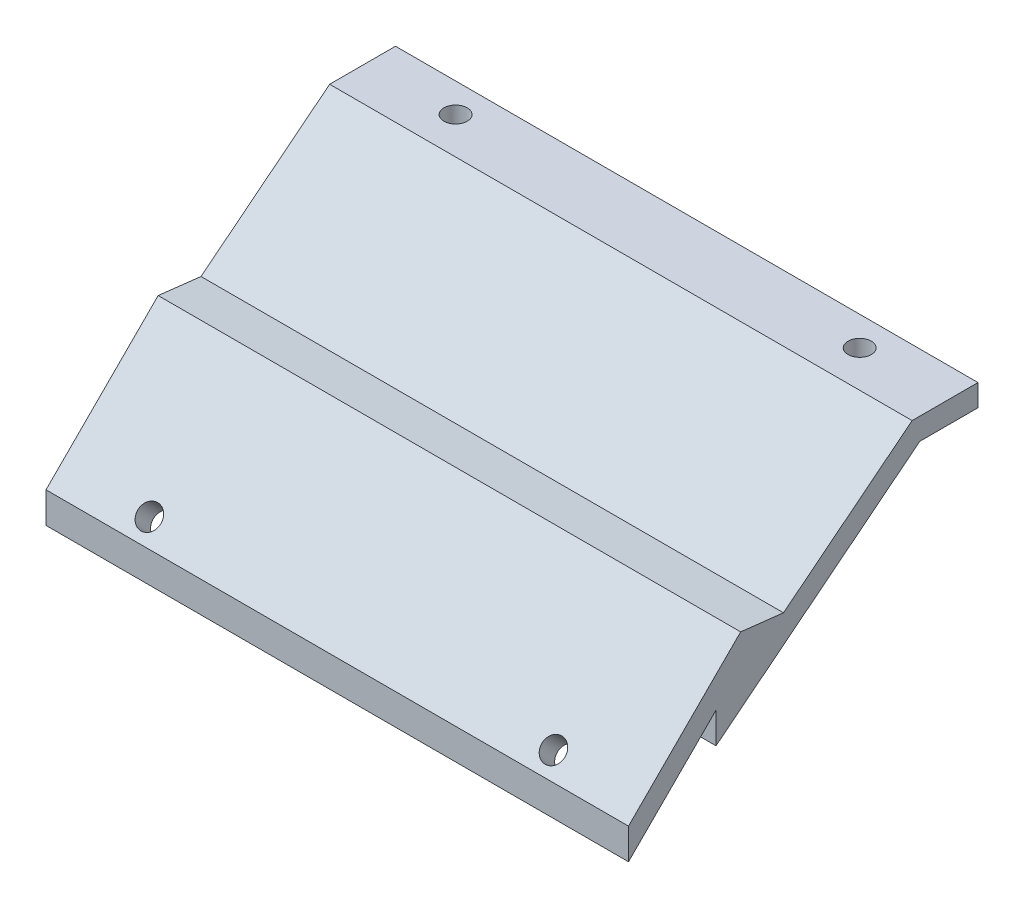
ISO-10303-21;
HEADER;
FILE_DESCRIPTION(('STEP AP214'),'2;1');
FILE_NAME('part.step','',(''),(''),'','','');
FILE_SCHEMA(('AUTOMOTIVE_DESIGN { 1 0 10303 214 1 1 1 1 }'));
ENDSEC;
DATA;
#1=APPLICATION_CONTEXT('core data for automotive mechanical design processes');
#2=APPLICATION_PROTOCOL_DEFINITION('international standard','automotive_design',2000,#1);
#3=PRODUCT_CONTEXT('',#1,'mechanical');
#4=PRODUCT('Part','Part','',(#3));
#5=PRODUCT_RELATED_PRODUCT_CATEGORY('part','',(#4));
#6=PRODUCT_DEFINITION_FORMATION('','',#4);
#7=PRODUCT_DEFINITION_CONTEXT('part definition',#1,'design');
#8=PRODUCT_DEFINITION('design','',#6,#7);
#9=PRODUCT_DEFINITION_SHAPE('','',#8);
#10=(LENGTH_UNIT() NAMED_UNIT(*) SI_UNIT(.MILLI.,.METRE.));
#11=(NAMED_UNIT(*) PLANE_ANGLE_UNIT() SI_UNIT($,.RADIAN.));
#12=(NAMED_UNIT(*) SI_UNIT($,.STERADIAN.) SOLID_ANGLE_UNIT());
#13=UNCERTAINTY_MEASURE_WITH_UNIT(LENGTH_MEASURE(1.E-05),#10,'distance_accuracy_value','');
#14=(GEOMETRIC_REPRESENTATION_CONTEXT(3) GLOBAL_UNCERTAINTY_ASSIGNED_CONTEXT((#13)) GLOBAL_UNIT_ASSIGNED_CONTEXT((#10,
#11,#12)) REPRESENTATION_CONTEXT('',''));
#15=CARTESIAN_POINT('',(0.,0.,0.));
#16=DIRECTION('',(0.,0.,1.));
#17=DIRECTION('',(1.,0.,0.));
#18=AXIS2_PLACEMENT_3D('',#15,#16,#17);
#19=CARTESIAN_POINT('',(40.,0.,0.));
#20=DIRECTION('',(0.,-0.707106781186551,-0.707106781186544));
#21=DIRECTION('',(0.,0.707106781186544,-0.707106781186551));
#22=AXIS2_PLACEMENT_3D('',#19,#20,#21);
#23=PLANE('',#22);
#24=CARTESIAN_POINT('',(27.75,1.94454364826302,-1.94454364826303));
#25=DIRECTION('',(0.,-0.707106781186551,-0.707106781186544));
#26=DIRECTION('',(0.,0.707106781186544,-0.707106781186551));
#27=AXIS2_PLACEMENT_3D('',#24,#25,#26);
#28=CIRCLE('',#27,1.6);
#29=CARTESIAN_POINT('',(27.75,3.07591449816149,-3.07591449816152));
#30=VERTEX_POINT('',#29);
#31=EDGE_CURVE('E164',#30,#30,#28,.F.);
#32=ORIENTED_EDGE('',*,*,#31,.F.);
#33=EDGE_LOOP('',(#32));
#34=FACE_BOUND('',#33,.T.);
#35=CARTESIAN_POINT('',(-27.75,1.94454364826302,-1.94454364826304));
#36=DIRECTION('',(0.,-0.707106781186551,-0.707106781186544));
#37=DIRECTION('',(0.,0.707106781186544,-0.707106781186551));
#38=AXIS2_PLACEMENT_3D('',#35,#36,#37);
#39=CIRCLE('',#38,1.6);
#40=CARTESIAN_POINT('',(-27.75,3.07591449816149,-3.07591449816153));
#41=VERTEX_POINT('',#40);
#42=EDGE_CURVE('E249',#41,#41,#39,.F.);
#43=ORIENTED_EDGE('',*,*,#42,.F.);
#44=EDGE_LOOP('',(#43));
#45=FACE_BOUND('',#44,.T.);
#46=DIRECTION('',(0.,-0.707106781186544,0.707106781186551));
#47=VECTOR('',#46,1.);
#48=CARTESIAN_POINT('',(-40.,0.,0.));
#49=LINE('',#48,#47);
#50=CARTESIAN_POINT('',(-40.,15.4017394456447,-15.4017394456449));
#51=VERTEX_POINT('',#50);
#52=CARTESIAN_POINT('',(-40.,0.,0.));
#53=VERTEX_POINT('',#52);
#54=EDGE_CURVE('E65',#51,#53,#49,.T.);
#55=ORIENTED_EDGE('',*,*,#54,.T.);
#56=DIRECTION('',(-1.,0.,0.));
#57=VECTOR('',#56,1.);
#58=CARTESIAN_POINT('',(40.,0.,0.));
#59=LINE('',#58,#57);
#60=CARTESIAN_POINT('',(40.,0.,0.));
#61=VERTEX_POINT('',#60);
#62=EDGE_CURVE('E190',#61,#53,#59,.T.);
#63=ORIENTED_EDGE('',*,*,#62,.F.);
#64=DIRECTION('',(0.,-0.707106781186544,0.707106781186551));
#65=VECTOR('',#64,1.);
#66=CARTESIAN_POINT('',(40.,0.,0.));
#67=LINE('',#66,#65);
#68=CARTESIAN_POINT('',(40.,15.4017394456447,-15.4017394456449));
#69=VERTEX_POINT('',#68);
#70=EDGE_CURVE('E58',#69,#61,#67,.T.);
#71=ORIENTED_EDGE('',*,*,#70,.F.);
#72=DIRECTION('',(1.,0.,0.));
#73=VECTOR('',#72,1.);
#74=CARTESIAN_POINT('',(40.,15.4017394456447,-15.4017394456449));
#75=LINE('',#74,#73);
#76=EDGE_CURVE('E196',#69,#51,#75,.F.);
#77=ORIENTED_EDGE('',*,*,#76,.T.);
#78=EDGE_LOOP('',(#55,#63,#71,#77));
#79=FACE_BOUND('',#78,.T.);
#80=ADVANCED_FACE('F41',(#34,#45,#79),#23,.F.);
#81=CARTESIAN_POINT('',(40.,0.,0.));
#82=DIRECTION('',(0.,0.,-1.));
#83=DIRECTION('',(0.,1.,0.));
#84=AXIS2_PLACEMENT_3D('',#81,#82,#83);
#85=PLANE('',#84);
#86=DIRECTION('',(0.,-1.,0.));
#87=VECTOR('',#86,1.);
#88=CARTESIAN_POINT('',(-40.,0.,0.));
#89=LINE('',#88,#87);
#90=CARTESIAN_POINT('',(-40.,-4.24264068711926,0.));
#91=VERTEX_POINT('',#90);
#92=EDGE_CURVE('E163',#53,#91,#89,.T.);
#93=ORIENTED_EDGE('',*,*,#92,.T.);
#94=DIRECTION('',(-1.,0.,0.));
#95=VECTOR('',#94,1.);
#96=CARTESIAN_POINT('',(40.,-4.24264068711926,0.));
#97=LINE('',#96,#95);
#98=CARTESIAN_POINT('',(40.,-4.24264068711926,0.));
#99=VERTEX_POINT('',#98);
#100=EDGE_CURVE('E186',#99,#91,#97,.T.);
#101=ORIENTED_EDGE('',*,*,#100,.F.);
#102=DIRECTION('',(0.,-1.,0.));
#103=VECTOR('',#102,1.);
#104=CARTESIAN_POINT('',(40.,0.,0.));
#105=LINE('',#104,#103);
#106=EDGE_CURVE('E203',#61,#99,#105,.T.);
#107=ORIENTED_EDGE('',*,*,#106,.F.);
#108=ORIENTED_EDGE('',*,*,#62,.T.);
#109=EDGE_LOOP('',(#93,#101,#107,#108));
#110=FACE_BOUND('',#109,.T.);
#111=ADVANCED_FACE('F208',(#110),#85,.F.);
#112=CARTESIAN_POINT('',(40.,7.77817459305199,-12.0208152801714));
#113=DIRECTION('',(0.,0.707106781186551,0.707106781186544));
#114=DIRECTION('',(0.,-0.707106781186544,0.707106781186551));
#115=AXIS2_PLACEMENT_3D('',#112,#113,#114);
#116=PLANE('',#115);
#117=CARTESIAN_POINT('',(27.75,-0.176776695296637,-4.06586399182266));
#118=DIRECTION('',(0.,-0.707106781186551,-0.707106781186544));
#119=DIRECTION('',(0.,0.707106781186544,-0.707106781186551));
#120=AXIS2_PLACEMENT_3D('',#117,#118,#119);
#121=CIRCLE('',#120,1.6);
#122=CARTESIAN_POINT('',(27.75,0.954594154601834,-5.19723484172115));
#123=VERTEX_POINT('',#122);
#124=EDGE_CURVE('E245',#123,#123,#121,.T.);
#125=ORIENTED_EDGE('',*,*,#124,.F.);
#126=EDGE_LOOP('',(#125));
#127=FACE_BOUND('',#126,.T.);
#128=CARTESIAN_POINT('',(-27.75,-0.17677669529663,-4.06586399182267));
#129=DIRECTION('',(0.,-0.707106781186551,-0.707106781186544));
#130=DIRECTION('',(0.,0.707106781186544,-0.707106781186551));
#131=AXIS2_PLACEMENT_3D('',#128,#129,#130);
#132=CIRCLE('',#131,1.6);
#133=CARTESIAN_POINT('',(-27.75,0.954594154601841,-5.19723484172115));
#134=VERTEX_POINT('',#133);
#135=EDGE_CURVE('E244',#134,#134,#132,.T.);
#136=ORIENTED_EDGE('',*,*,#135,.F.);
#137=EDGE_LOOP('',(#136));
#138=FACE_BOUND('',#137,.T.);
#139=DIRECTION('',(0.,0.707106781186544,-0.707106781186551));
#140=VECTOR('',#139,1.);
#141=CARTESIAN_POINT('',(-40.,7.77817459305199,-12.0208152801714));
#142=LINE('',#141,#140);
#143=CARTESIAN_POINT('',(-40.,7.77817459305199,-12.0208152801714));
#144=VERTEX_POINT('',#143);
#145=EDGE_CURVE('E167',#91,#144,#142,.T.);
#146=ORIENTED_EDGE('',*,*,#145,.T.);
#147=DIRECTION('',(-1.,0.,0.));
#148=VECTOR('',#147,1.);
#149=CARTESIAN_POINT('',(40.,7.77817459305199,-12.0208152801714));
#150=LINE('',#149,#148);
#151=CARTESIAN_POINT('',(40.,7.77817459305199,-12.0208152801714));
#152=VERTEX_POINT('',#151);
#153=EDGE_CURVE('E182',#152,#144,#150,.T.);
#154=ORIENTED_EDGE('',*,*,#153,.F.);
#155=DIRECTION('',(0.,0.707106781186544,-0.707106781186551));
#156=VECTOR('',#155,1.);
#157=CARTESIAN_POINT('',(40.,7.77817459305199,-12.0208152801714));
#158=LINE('',#157,#156);
#159=EDGE_CURVE('E211',#99,#152,#158,.T.);
#160=ORIENTED_EDGE('',*,*,#159,.F.);
#161=ORIENTED_EDGE('',*,*,#100,.T.);
#162=EDGE_LOOP('',(#146,#154,#160,#161));
#163=FACE_BOUND('',#162,.T.);
#164=ADVANCED_FACE('F267',(#127,#138,#163),#116,.F.);
#165=CARTESIAN_POINT('',(40.,3.53817459305199,-12.0208152801714));
#166=DIRECTION('',(0.,0.,-1.));
#167=DIRECTION('',(-1.,0.,0.));
#168=AXIS2_PLACEMENT_3D('',#165,#166,#167);
#169=PLANE('',#168);
#170=DIRECTION('',(0.,-1.,0.));
#171=VECTOR('',#170,1.);
#172=CARTESIAN_POINT('',(-40.,3.53817459305199,-12.0208152801714));
#173=LINE('',#172,#171);
#174=CARTESIAN_POINT('',(-40.,3.53817459305199,-12.0208152801714));
#175=VERTEX_POINT('',#174);
#176=EDGE_CURVE('E170',#144,#175,#173,.T.);
#177=ORIENTED_EDGE('',*,*,#176,.T.);
#178=DIRECTION('',(-1.,0.,0.));
#179=VECTOR('',#178,1.);
#180=CARTESIAN_POINT('',(40.,3.53817459305199,-12.0208152801714));
#181=LINE('',#180,#179);
#182=CARTESIAN_POINT('',(40.,3.53817459305199,-12.0208152801714));
#183=VERTEX_POINT('',#182);
#184=EDGE_CURVE('E155',#183,#175,#181,.T.);
#185=ORIENTED_EDGE('',*,*,#184,.F.);
#186=DIRECTION('',(0.,-1.,0.));
#187=VECTOR('',#186,1.);
#188=CARTESIAN_POINT('',(40.,3.53817459305199,-12.0208152801714));
#189=LINE('',#188,#187);
#190=EDGE_CURVE('E157',#152,#183,#189,.T.);
#191=ORIENTED_EDGE('',*,*,#190,.F.);
#192=ORIENTED_EDGE('',*,*,#153,.T.);
#193=EDGE_LOOP('',(#177,#185,#191,#192));
#194=FACE_BOUND('',#193,.T.);
#195=ADVANCED_FACE('F223',(#194),#169,.F.);
#196=CARTESIAN_POINT('',(40.,25.7573593128807,-40.));
#197=DIRECTION('',(0.,0.783105117367852,0.621889359253141));
#198=DIRECTION('',(0.,-0.621889359253141,0.783105117367852));
#199=AXIS2_PLACEMENT_3D('',#196,#197,#198);
#200=PLANE('',#199);
#201=DIRECTION('',(0.,0.621889359253141,-0.783105117367852));
#202=VECTOR('',#201,1.);
#203=CARTESIAN_POINT('',(-40.,25.7573593128807,-40.));
#204=LINE('',#203,#202);
#205=CARTESIAN_POINT('',(-40.,25.7573593128807,-40.));
#206=VERTEX_POINT('',#205);
#207=EDGE_CURVE('E173',#175,#206,#204,.T.);
#208=ORIENTED_EDGE('',*,*,#207,.T.);
#209=DIRECTION('',(-1.,0.,0.));
#210=VECTOR('',#209,1.);
#211=CARTESIAN_POINT('',(40.,25.7573593128807,-40.));
#212=LINE('',#211,#210);
#213=CARTESIAN_POINT('',(40.,25.7573593128807,-40.));
#214=VERTEX_POINT('',#213);
#215=EDGE_CURVE('E149',#214,#206,#212,.T.);
#216=ORIENTED_EDGE('',*,*,#215,.F.);
#217=DIRECTION('',(0.,0.621889359253141,-0.783105117367852));
#218=VECTOR('',#217,1.);
#219=CARTESIAN_POINT('',(40.,25.7573593128807,-40.));
#220=LINE('',#219,#218);
#221=EDGE_CURVE('E150',#183,#214,#220,.T.);
#222=ORIENTED_EDGE('',*,*,#221,.F.);
#223=ORIENTED_EDGE('',*,*,#184,.T.);
#224=EDGE_LOOP('',(#208,#216,#222,#223));
#225=FACE_BOUND('',#224,.T.);
#226=ADVANCED_FACE('F227',(#225),#200,.F.);
#227=CARTESIAN_POINT('',(40.,9.75147593644475,-15.0208152801714));
#228=DIRECTION('',(0.,-0.783105117367852,-0.621889359253141));
#229=DIRECTION('',(0.,0.621889359253141,-0.783105117367852));
#230=AXIS2_PLACEMENT_3D('',#227,#228,#229);
#231=PLANE('',#230);
#232=DIRECTION('',(0.,-0.621889359253141,0.783105117367852));
#233=VECTOR('',#232,1.);
#234=CARTESIAN_POINT('',(-40.,9.75147593644475,-15.0208152801714));
#235=LINE('',#234,#233);
#236=CARTESIAN_POINT('',(-40.,28.7573593128807,-38.9536970874081));
#237=VERTEX_POINT('',#236);
#238=CARTESIAN_POINT('',(-40.,14.7265908104699,-21.2856562191142));
#239=VERTEX_POINT('',#238);
#240=EDGE_CURVE('E176',#237,#239,#235,.T.);
#241=ORIENTED_EDGE('',*,*,#240,.T.);
#242=DIRECTION('',(1.,0.,0.));
#243=VECTOR('',#242,1.);
#244=CARTESIAN_POINT('',(40.,14.7265908104699,-21.2856562191142));
#245=LINE('',#244,#243);
#246=CARTESIAN_POINT('',(40.,14.7265908104699,-21.2856562191142));
#247=VERTEX_POINT('',#246);
#248=EDGE_CURVE('E147',#239,#247,#245,.T.);
#249=ORIENTED_EDGE('',*,*,#248,.T.);
#250=DIRECTION('',(0.,-0.621889359253141,0.783105117367852));
#251=VECTOR('',#250,1.);
#252=CARTESIAN_POINT('',(40.,9.75147593644475,-15.0208152801714));
#253=LINE('',#252,#251);
#254=CARTESIAN_POINT('',(40.,28.7573593128807,-38.9536970874081));
#255=VERTEX_POINT('',#254);
#256=EDGE_CURVE('E125',#255,#247,#253,.T.);
#257=ORIENTED_EDGE('',*,*,#256,.F.);
#258=DIRECTION('',(-1.,0.,0.));
#259=VECTOR('',#258,1.);
#260=CARTESIAN_POINT('',(40.,28.7573593128807,-38.9536970874081));
#261=LINE('',#260,#259);
#262=EDGE_CURVE('E134',#255,#237,#261,.T.);
#263=ORIENTED_EDGE('',*,*,#262,.T.);
#264=EDGE_LOOP('',(#241,#249,#257,#263));
#265=FACE_BOUND('',#264,.T.);
#266=ADVANCED_FACE('F145',(#265),#231,.F.);
#267=CARTESIAN_POINT('',(40.,0.,0.));
#268=DIRECTION('',(-1.,0.,0.));
#269=DIRECTION('',(0.,0.,1.));
#270=AXIS2_PLACEMENT_3D('',#267,#268,#269);
#271=PLANE('',#270);
#272=DIRECTION('',(0.,0.,1.));
#273=VECTOR('',#272,1.);
#274=CARTESIAN_POINT('',(40.,28.7573593128807,-48.));
#275=LINE('',#274,#273);
#276=CARTESIAN_POINT('',(40.,28.7573593128807,-48.));
#277=VERTEX_POINT('',#276);
#278=EDGE_CURVE('E121',#277,#255,#275,.T.);
#279=ORIENTED_EDGE('',*,*,#278,.T.);
#280=ORIENTED_EDGE('',*,*,#256,.T.);
#281=DIRECTION('',(0.,-0.11399675579705,-0.993481121948348));
#282=VECTOR('',#281,1.);
#283=CARTESIAN_POINT('',(40.,16.9458926531585,-1.94445243484514));
#284=LINE('',#283,#282);
#285=EDGE_CURVE('E11',#247,#69,#284,.F.);
#286=ORIENTED_EDGE('',*,*,#285,.T.);
#287=ORIENTED_EDGE('',*,*,#70,.T.);
#288=ORIENTED_EDGE('',*,*,#106,.T.);
#289=ORIENTED_EDGE('',*,*,#159,.T.);
#290=ORIENTED_EDGE('',*,*,#190,.T.);
#291=ORIENTED_EDGE('',*,*,#221,.T.);
#292=DIRECTION('',(0.,0.,1.));
#293=VECTOR('',#292,1.);
#294=CARTESIAN_POINT('',(40.,25.7573593128807,-48.));
#295=LINE('',#294,#293);
#296=CARTESIAN_POINT('',(40.,25.7573593128807,-48.));
#297=VERTEX_POINT('',#296);
#298=EDGE_CURVE('E131',#297,#214,#295,.T.);
#299=ORIENTED_EDGE('',*,*,#298,.F.);
#300=DIRECTION('',(0.,-1.,0.));
#301=VECTOR('',#300,1.);
#302=CARTESIAN_POINT('',(40.,28.7573593128807,-48.));
#303=LINE('',#302,#301);
#304=EDGE_CURVE('E127',#277,#297,#303,.T.);
#305=ORIENTED_EDGE('',*,*,#304,.F.);
#306=EDGE_LOOP('',(#279,#280,#286,#287,#288,#289,#290,#291,#299,#305));
#307=FACE_BOUND('',#306,.T.);
#308=ADVANCED_FACE('F123',(#307),#271,.F.);
#309=CARTESIAN_POINT('',(-40.,0.,0.));
#310=DIRECTION('',(-1.,0.,0.));
#311=DIRECTION('',(0.,0.,1.));
#312=AXIS2_PLACEMENT_3D('',#309,#310,#311);
#313=PLANE('',#312);
#314=ORIENTED_EDGE('',*,*,#240,.F.);
#315=DIRECTION('',(0.,0.,1.));
#316=VECTOR('',#315,1.);
#317=CARTESIAN_POINT('',(-40.,28.7573593128807,-48.));
#318=LINE('',#317,#316);
#319=CARTESIAN_POINT('',(-40.,28.7573593128807,-48.));
#320=VERTEX_POINT('',#319);
#321=EDGE_CURVE('E130',#320,#237,#318,.T.);
#322=ORIENTED_EDGE('',*,*,#321,.F.);
#323=DIRECTION('',(0.,1.,0.));
#324=VECTOR('',#323,1.);
#325=CARTESIAN_POINT('',(-40.,28.7573593128807,-48.));
#326=LINE('',#325,#324);
#327=CARTESIAN_POINT('',(-40.,25.7573593128807,-48.));
#328=VERTEX_POINT('',#327);
#329=EDGE_CURVE('E141',#328,#320,#326,.T.);
#330=ORIENTED_EDGE('',*,*,#329,.F.);
#331=DIRECTION('',(0.,0.,1.));
#332=VECTOR('',#331,1.);
#333=CARTESIAN_POINT('',(-40.,25.7573593128807,-48.));
#334=LINE('',#333,#332);
#335=EDGE_CURVE('E236',#328,#206,#334,.T.);
#336=ORIENTED_EDGE('',*,*,#335,.T.);
#337=ORIENTED_EDGE('',*,*,#207,.F.);
#338=ORIENTED_EDGE('',*,*,#176,.F.);
#339=ORIENTED_EDGE('',*,*,#145,.F.);
#340=ORIENTED_EDGE('',*,*,#92,.F.);
#341=ORIENTED_EDGE('',*,*,#54,.F.);
#342=DIRECTION('',(0.,0.11399675579705,0.993481121948348));
#343=VECTOR('',#342,1.);
#344=CARTESIAN_POINT('',(-40.,15.4454484987,-15.0208152801714));
#345=LINE('',#344,#343);
#346=EDGE_CURVE('E51',#51,#239,#345,.F.);
#347=ORIENTED_EDGE('',*,*,#346,.T.);
#348=EDGE_LOOP('',(#314,#322,#330,#336,#337,#338,#339,#340,#341,#347));
#349=FACE_BOUND('',#348,.T.);
#350=ADVANCED_FACE('F200',(#349),#313,.T.);
#351=CARTESIAN_POINT('',(-27.75,5.14454364826304,1.25545635173694));
#352=DIRECTION('',(0.,-0.707106781186551,-0.707106781186544));
#353=DIRECTION('',(0.,0.707106781186544,-0.707106781186551));
#354=AXIS2_PLACEMENT_3D('',#351,#352,#353);
#355=CYLINDRICAL_SURFACE('',#354,1.6);
#356=ORIENTED_EDGE('',*,*,#42,.T.);
#357=EDGE_LOOP('',(#356));
#358=FACE_BOUND('',#357,.T.);
#359=ORIENTED_EDGE('',*,*,#135,.T.);
#360=EDGE_LOOP('',(#359));
#361=FACE_BOUND('',#360,.T.);
#362=ADVANCED_FACE('F259',(#358,#361),#355,.F.);
#363=CARTESIAN_POINT('',(27.75,5.14454364826304,1.25545635173695));
#364=DIRECTION('',(0.,-0.707106781186551,-0.707106781186544));
#365=DIRECTION('',(0.,0.707106781186544,-0.707106781186551));
#366=AXIS2_PLACEMENT_3D('',#363,#364,#365);
#367=CYLINDRICAL_SURFACE('',#366,1.6);
#368=ORIENTED_EDGE('',*,*,#31,.T.);
#369=EDGE_LOOP('',(#368));
#370=FACE_BOUND('',#369,.T.);
#371=ORIENTED_EDGE('',*,*,#124,.T.);
#372=EDGE_LOOP('',(#371));
#373=FACE_BOUND('',#372,.T.);
#374=ADVANCED_FACE('F286',(#370,#373),#367,.F.);
#375=CARTESIAN_POINT('',(40.,28.7573593128807,-48.));
#376=DIRECTION('',(0.,-1.,0.));
#377=DIRECTION('',(1.,0.,0.));
#378=AXIS2_PLACEMENT_3D('',#375,#376,#377);
#379=PLANE('',#378);
#380=CARTESIAN_POINT('',(-27.75,28.7573593128807,-44.));
#381=DIRECTION('',(0.,-1.,0.));
#382=DIRECTION('',(1.,0.,0.));
#383=AXIS2_PLACEMENT_3D('',#380,#381,#382);
#384=CIRCLE('',#383,1.6);
#385=CARTESIAN_POINT('',(-26.15,28.7573593128807,-44.));
#386=VERTEX_POINT('',#385);
#387=EDGE_CURVE('E142',#386,#386,#384,.F.);
#388=ORIENTED_EDGE('',*,*,#387,.F.);
#389=EDGE_LOOP('',(#388));
#390=FACE_BOUND('',#389,.T.);
#391=CARTESIAN_POINT('',(27.75,28.7573593128807,-44.));
#392=DIRECTION('',(0.,-1.,0.));
#393=DIRECTION('',(1.,0.,0.));
#394=AXIS2_PLACEMENT_3D('',#391,#392,#393);
#395=CIRCLE('',#394,1.6);
#396=CARTESIAN_POINT('',(29.35,28.7573593128807,-44.));
#397=VERTEX_POINT('',#396);
#398=EDGE_CURVE('E316',#397,#397,#395,.F.);
#399=ORIENTED_EDGE('',*,*,#398,.F.);
#400=EDGE_LOOP('',(#399));
#401=FACE_BOUND('',#400,.T.);
#402=ORIENTED_EDGE('',*,*,#321,.T.);
#403=ORIENTED_EDGE('',*,*,#262,.F.);
#404=ORIENTED_EDGE('',*,*,#278,.F.);
#405=DIRECTION('',(1.,0.,0.));
#406=VECTOR('',#405,1.);
#407=CARTESIAN_POINT('',(40.,28.7573593128807,-48.));
#408=LINE('',#407,#406);
#409=EDGE_CURVE('E331',#320,#277,#408,.T.);
#410=ORIENTED_EDGE('',*,*,#409,.F.);
#411=EDGE_LOOP('',(#402,#403,#404,#410));
#412=FACE_BOUND('',#411,.T.);
#413=ADVANCED_FACE('F135',(#390,#401,#412),#379,.F.);
#414=CARTESIAN_POINT('',(40.,25.7573593128807,-48.));
#415=DIRECTION('',(0.,1.,0.));
#416=DIRECTION('',(0.,0.,1.));
#417=AXIS2_PLACEMENT_3D('',#414,#415,#416);
#418=PLANE('',#417);
#419=CARTESIAN_POINT('',(-27.75,25.7573593128807,-44.));
#420=DIRECTION('',(0.,-1.,0.));
#421=DIRECTION('',(0.,0.,-1.));
#422=AXIS2_PLACEMENT_3D('',#419,#420,#421);
#423=CIRCLE('',#422,1.6);
#424=CARTESIAN_POINT('',(-27.75,25.7573593128807,-45.6));
#425=VERTEX_POINT('',#424);
#426=EDGE_CURVE('E314',#425,#425,#423,.T.);
#427=ORIENTED_EDGE('',*,*,#426,.F.);
#428=EDGE_LOOP('',(#427));
#429=FACE_BOUND('',#428,.T.);
#430=CARTESIAN_POINT('',(27.75,25.7573593128807,-44.));
#431=DIRECTION('',(0.,-1.,0.));
#432=DIRECTION('',(0.,0.,-1.));
#433=AXIS2_PLACEMENT_3D('',#430,#431,#432);
#434=CIRCLE('',#433,1.6);
#435=CARTESIAN_POINT('',(27.75,25.7573593128807,-45.6));
#436=VERTEX_POINT('',#435);
#437=EDGE_CURVE('E322',#436,#436,#434,.T.);
#438=ORIENTED_EDGE('',*,*,#437,.F.);
#439=EDGE_LOOP('',(#438));
#440=FACE_BOUND('',#439,.T.);
#441=ORIENTED_EDGE('',*,*,#215,.T.);
#442=ORIENTED_EDGE('',*,*,#335,.F.);
#443=DIRECTION('',(-1.,0.,0.));
#444=VECTOR('',#443,1.);
#445=CARTESIAN_POINT('',(40.,25.7573593128807,-48.));
#446=LINE('',#445,#444);
#447=EDGE_CURVE('E234',#297,#328,#446,.T.);
#448=ORIENTED_EDGE('',*,*,#447,.F.);
#449=ORIENTED_EDGE('',*,*,#298,.T.);
#450=EDGE_LOOP('',(#441,#442,#448,#449));
#451=FACE_BOUND('',#450,.T.);
#452=ADVANCED_FACE('F233',(#429,#440,#451),#418,.F.);
#453=CARTESIAN_POINT('',(0.,0.,-48.));
#454=DIRECTION('',(0.,0.,-1.));
#455=DIRECTION('',(-1.,0.,0.));
#456=AXIS2_PLACEMENT_3D('',#453,#454,#455);
#457=PLANE('',#456);
#458=ORIENTED_EDGE('',*,*,#329,.T.);
#459=ORIENTED_EDGE('',*,*,#409,.T.);
#460=ORIENTED_EDGE('',*,*,#304,.T.);
#461=ORIENTED_EDGE('',*,*,#447,.T.);
#462=EDGE_LOOP('',(#458,#459,#460,#461));
#463=FACE_BOUND('',#462,.T.);
#464=ADVANCED_FACE('F295',(#463),#457,.T.);
#465=CARTESIAN_POINT('',(40.,15.4454484987,-15.0208152801714));
#466=DIRECTION('',(0.,0.993481121948348,-0.11399675579705));
#467=DIRECTION('',(1.,0.,0.));
#468=AXIS2_PLACEMENT_3D('',#465,#466,#467);
#469=PLANE('',#468);
#470=ORIENTED_EDGE('',*,*,#285,.F.);
#471=ORIENTED_EDGE('',*,*,#248,.F.);
#472=ORIENTED_EDGE('',*,*,#346,.F.);
#473=ORIENTED_EDGE('',*,*,#76,.F.);
#474=EDGE_LOOP('',(#470,#471,#472,#473));
#475=FACE_BOUND('',#474,.T.);
#476=ADVANCED_FACE('F44',(#475),#469,.T.);
#477=CARTESIAN_POINT('',(27.75,33.2828427124746,-44.));
#478=DIRECTION('',(0.,-1.,0.));
#479=DIRECTION('',(0.,0.,-1.));
#480=AXIS2_PLACEMENT_3D('',#477,#478,#479);
#481=CYLINDRICAL_SURFACE('',#480,1.6);
#482=ORIENTED_EDGE('',*,*,#398,.T.);
#483=EDGE_LOOP('',(#482));
#484=FACE_BOUND('',#483,.T.);
#485=ORIENTED_EDGE('',*,*,#437,.T.);
#486=EDGE_LOOP('',(#485));
#487=FACE_BOUND('',#486,.T.);
#488=ADVANCED_FACE('F300',(#484,#487),#481,.F.);
#489=CARTESIAN_POINT('',(-27.75,33.2828427124746,-44.));
#490=DIRECTION('',(0.,-1.,0.));
#491=DIRECTION('',(0.,0.,-1.));
#492=AXIS2_PLACEMENT_3D('',#489,#490,#491);
#493=CYLINDRICAL_SURFACE('',#492,1.6);
#494=ORIENTED_EDGE('',*,*,#387,.T.);
#495=EDGE_LOOP('',(#494));
#496=FACE_BOUND('',#495,.T.);
#497=ORIENTED_EDGE('',*,*,#426,.T.);
#498=EDGE_LOOP('',(#497));
#499=FACE_BOUND('',#498,.T.);
#500=ADVANCED_FACE('F303',(#496,#499),#493,.F.);
#501=CLOSED_SHELL('',(#80,#111,#164,#195,#226,#266,#308,#350,#362,#374,#413,#452,#464,#476,#488,#500));
#502=MANIFOLD_SOLID_BREP('B2',#501);
#503=ADVANCED_BREP_SHAPE_REPRESENTATION('',(#18,#502),#14);
#504=SHAPE_DEFINITION_REPRESENTATION(#9,#503);
ENDSEC;
END-ISO-10303-21;
